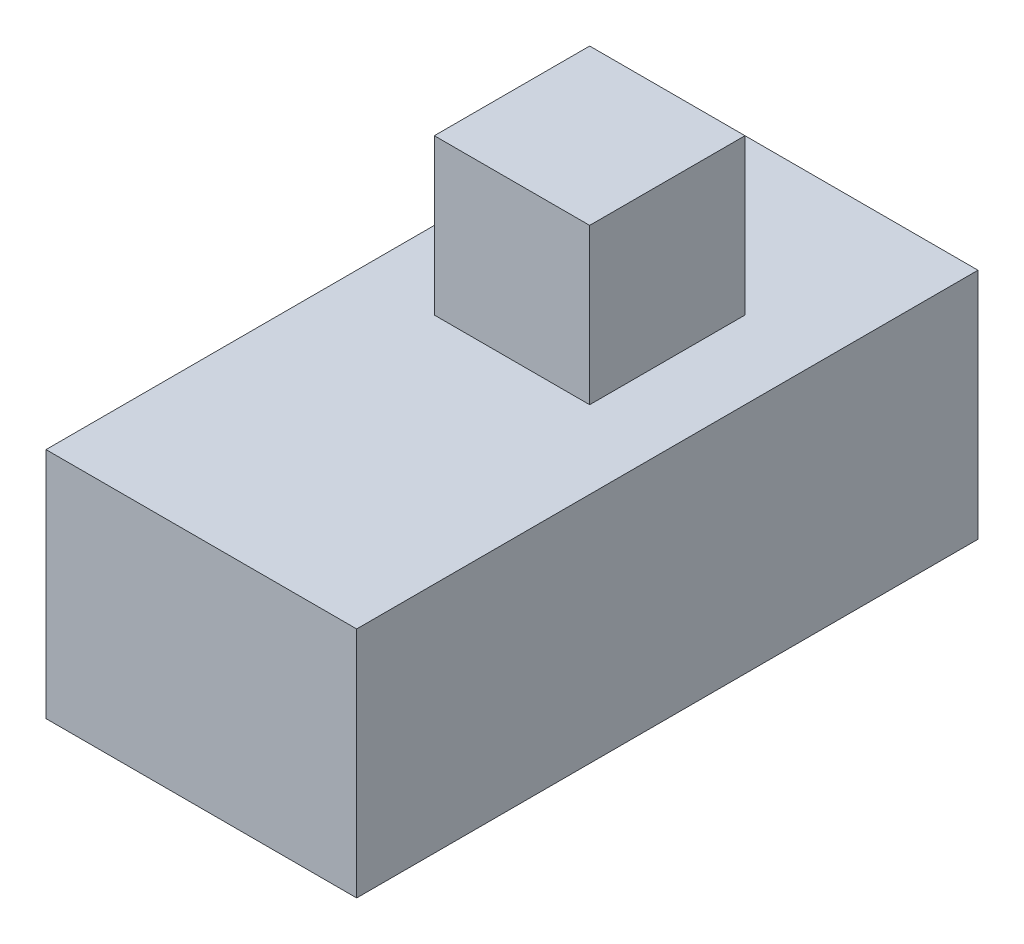
ISO-10303-21;
HEADER;
FILE_DESCRIPTION(('STEP AP214'),'2;1');
FILE_NAME('part.step','',(''),(''),'','','');
FILE_SCHEMA(('AUTOMOTIVE_DESIGN { 1 0 10303 214 1 1 1 1 }'));
ENDSEC;
DATA;
#1=APPLICATION_CONTEXT('core data for automotive mechanical design processes');
#2=APPLICATION_PROTOCOL_DEFINITION('international standard','automotive_design',2000,#1);
#3=PRODUCT_CONTEXT('',#1,'mechanical');
#4=PRODUCT('Part','Part','',(#3));
#5=PRODUCT_RELATED_PRODUCT_CATEGORY('part','',(#4));
#6=PRODUCT_DEFINITION_FORMATION('','',#4);
#7=PRODUCT_DEFINITION_CONTEXT('part definition',#1,'design');
#8=PRODUCT_DEFINITION('design','',#6,#7);
#9=PRODUCT_DEFINITION_SHAPE('','',#8);
#10=(LENGTH_UNIT() NAMED_UNIT(*) SI_UNIT(.MILLI.,.METRE.));
#11=(NAMED_UNIT(*) PLANE_ANGLE_UNIT() SI_UNIT($,.RADIAN.));
#12=(NAMED_UNIT(*) SI_UNIT($,.STERADIAN.) SOLID_ANGLE_UNIT());
#13=UNCERTAINTY_MEASURE_WITH_UNIT(LENGTH_MEASURE(1.E-05),#10,'distance_accuracy_value','');
#14=(GEOMETRIC_REPRESENTATION_CONTEXT(3) GLOBAL_UNCERTAINTY_ASSIGNED_CONTEXT((#13)) GLOBAL_UNIT_ASSIGNED_CONTEXT((#10,
#11,#12)) REPRESENTATION_CONTEXT('',''));
#15=CARTESIAN_POINT('',(0.,0.,0.));
#16=DIRECTION('',(0.,0.,1.));
#17=DIRECTION('',(1.,0.,0.));
#18=AXIS2_PLACEMENT_3D('',#15,#16,#17);
#19=CARTESIAN_POINT('',(0.,3.,0.));
#20=DIRECTION('',(0.,1.,0.));
#21=DIRECTION('',(0.,0.,1.));
#22=AXIS2_PLACEMENT_3D('',#19,#20,#21);
#23=PLANE('',#22);
#24=DIRECTION('',(0.,0.,1.));
#25=VECTOR('',#24,1.);
#26=CARTESIAN_POINT('',(0.,3.,0.));
#27=LINE('',#26,#25);
#28=CARTESIAN_POINT('',(0.,3.,0.));
#29=VERTEX_POINT('',#28);
#30=CARTESIAN_POINT('',(0.,3.,8.));
#31=VERTEX_POINT('',#30);
#32=EDGE_CURVE('E140',#29,#31,#27,.T.);
#33=ORIENTED_EDGE('',*,*,#32,.T.);
#34=DIRECTION('',(1.,0.,0.));
#35=VECTOR('',#34,1.);
#36=CARTESIAN_POINT('',(0.,3.,8.));
#37=LINE('',#36,#35);
#38=CARTESIAN_POINT('',(4.,3.,8.));
#39=VERTEX_POINT('',#38);
#40=EDGE_CURVE('E85',#31,#39,#37,.T.);
#41=ORIENTED_EDGE('',*,*,#40,.T.);
#42=DIRECTION('',(0.,0.,-1.));
#43=VECTOR('',#42,1.);
#44=CARTESIAN_POINT('',(4.,3.,0.));
#45=LINE('',#44,#43);
#46=CARTESIAN_POINT('',(4.,3.,0.));
#47=VERTEX_POINT('',#46);
#48=EDGE_CURVE('E143',#39,#47,#45,.T.);
#49=ORIENTED_EDGE('',*,*,#48,.T.);
#50=DIRECTION('',(-1.,0.,0.));
#51=VECTOR('',#50,1.);
#52=CARTESIAN_POINT('',(0.,3.,0.));
#53=LINE('',#52,#51);
#54=EDGE_CURVE('E57',#47,#29,#53,.T.);
#55=ORIENTED_EDGE('',*,*,#54,.T.);
#56=EDGE_LOOP('',(#33,#41,#49,#55));
#57=FACE_BOUND('',#56,.T.);
#58=DIRECTION('',(1.,0.,0.));
#59=VECTOR('',#58,1.);
#60=CARTESIAN_POINT('',(1.,3.,4.));
#61=LINE('',#60,#59);
#62=CARTESIAN_POINT('',(1.,3.,4.));
#63=VERTEX_POINT('',#62);
#64=CARTESIAN_POINT('',(3.,3.,4.));
#65=VERTEX_POINT('',#64);
#66=EDGE_CURVE('E263',#63,#65,#61,.T.);
#67=ORIENTED_EDGE('',*,*,#66,.F.);
#68=DIRECTION('',(0.,0.,1.));
#69=VECTOR('',#68,1.);
#70=CARTESIAN_POINT('',(1.,3.,2.));
#71=LINE('',#70,#69);
#72=CARTESIAN_POINT('',(1.,3.,2.));
#73=VERTEX_POINT('',#72);
#74=EDGE_CURVE('E130',#73,#63,#71,.T.);
#75=ORIENTED_EDGE('',*,*,#74,.F.);
#76=DIRECTION('',(-1.,0.,0.));
#77=VECTOR('',#76,1.);
#78=CARTESIAN_POINT('',(1.,3.,2.));
#79=LINE('',#78,#77);
#80=CARTESIAN_POINT('',(3.,3.,2.));
#81=VERTEX_POINT('',#80);
#82=EDGE_CURVE('E126',#81,#73,#79,.T.);
#83=ORIENTED_EDGE('',*,*,#82,.F.);
#84=DIRECTION('',(0.,0.,-1.));
#85=VECTOR('',#84,1.);
#86=CARTESIAN_POINT('',(3.,3.,2.));
#87=LINE('',#86,#85);
#88=EDGE_CURVE('E260',#65,#81,#87,.T.);
#89=ORIENTED_EDGE('',*,*,#88,.F.);
#90=EDGE_LOOP('',(#67,#75,#83,#89));
#91=FACE_BOUND('',#90,.T.);
#92=ADVANCED_FACE('F33',(#57,#91),#23,.T.);
#93=CARTESIAN_POINT('',(0.,3.,0.));
#94=DIRECTION('',(1.,0.,0.));
#95=DIRECTION('',(0.,0.,-1.));
#96=AXIS2_PLACEMENT_3D('',#93,#94,#95);
#97=PLANE('',#96);
#98=DIRECTION('',(0.,0.,1.));
#99=VECTOR('',#98,1.);
#100=CARTESIAN_POINT('',(0.,0.,0.));
#101=LINE('',#100,#99);
#102=CARTESIAN_POINT('',(0.,0.,0.));
#103=VERTEX_POINT('',#102);
#104=CARTESIAN_POINT('',(0.,0.,8.));
#105=VERTEX_POINT('',#104);
#106=EDGE_CURVE('E132',#103,#105,#101,.T.);
#107=ORIENTED_EDGE('',*,*,#106,.T.);
#108=DIRECTION('',(0.,-1.,0.));
#109=VECTOR('',#108,1.);
#110=CARTESIAN_POINT('',(0.,3.,8.));
#111=LINE('',#110,#109);
#112=EDGE_CURVE('E11',#31,#105,#111,.T.);
#113=ORIENTED_EDGE('',*,*,#112,.F.);
#114=ORIENTED_EDGE('',*,*,#32,.F.);
#115=DIRECTION('',(0.,-1.,0.));
#116=VECTOR('',#115,1.);
#117=CARTESIAN_POINT('',(0.,3.,0.));
#118=LINE('',#117,#116);
#119=EDGE_CURVE('E145',#29,#103,#118,.T.);
#120=ORIENTED_EDGE('',*,*,#119,.T.);
#121=EDGE_LOOP('',(#107,#113,#114,#120));
#122=FACE_BOUND('',#121,.T.);
#123=ADVANCED_FACE('F35',(#122),#97,.F.);
#124=CARTESIAN_POINT('',(0.,3.,8.));
#125=DIRECTION('',(0.,0.,-1.));
#126=DIRECTION('',(-1.,0.,0.));
#127=AXIS2_PLACEMENT_3D('',#124,#125,#126);
#128=PLANE('',#127);
#129=DIRECTION('',(1.,0.,0.));
#130=VECTOR('',#129,1.);
#131=CARTESIAN_POINT('',(0.,0.,8.));
#132=LINE('',#131,#130);
#133=CARTESIAN_POINT('',(4.,0.,8.));
#134=VERTEX_POINT('',#133);
#135=EDGE_CURVE('E135',#105,#134,#132,.T.);
#136=ORIENTED_EDGE('',*,*,#135,.T.);
#137=DIRECTION('',(0.,-1.,0.));
#138=VECTOR('',#137,1.);
#139=CARTESIAN_POINT('',(4.,3.,8.));
#140=LINE('',#139,#138);
#141=EDGE_CURVE('E41',#39,#134,#140,.T.);
#142=ORIENTED_EDGE('',*,*,#141,.F.);
#143=ORIENTED_EDGE('',*,*,#40,.F.);
#144=ORIENTED_EDGE('',*,*,#112,.T.);
#145=EDGE_LOOP('',(#136,#142,#143,#144));
#146=FACE_BOUND('',#145,.T.);
#147=ADVANCED_FACE('F173',(#146),#128,.F.);
#148=CARTESIAN_POINT('',(4.,3.,0.));
#149=DIRECTION('',(-1.,0.,0.));
#150=DIRECTION('',(0.,0.,1.));
#151=AXIS2_PLACEMENT_3D('',#148,#149,#150);
#152=PLANE('',#151);
#153=DIRECTION('',(0.,0.,-1.));
#154=VECTOR('',#153,1.);
#155=CARTESIAN_POINT('',(4.,0.,0.));
#156=LINE('',#155,#154);
#157=CARTESIAN_POINT('',(4.,0.,0.));
#158=VERTEX_POINT('',#157);
#159=EDGE_CURVE('E148',#134,#158,#156,.T.);
#160=ORIENTED_EDGE('',*,*,#159,.T.);
#161=DIRECTION('',(0.,-1.,0.));
#162=VECTOR('',#161,1.);
#163=CARTESIAN_POINT('',(4.,3.,0.));
#164=LINE('',#163,#162);
#165=EDGE_CURVE('E152',#47,#158,#164,.T.);
#166=ORIENTED_EDGE('',*,*,#165,.F.);
#167=ORIENTED_EDGE('',*,*,#48,.F.);
#168=ORIENTED_EDGE('',*,*,#141,.T.);
#169=EDGE_LOOP('',(#160,#166,#167,#168));
#170=FACE_BOUND('',#169,.T.);
#171=ADVANCED_FACE('F157',(#170),#152,.F.);
#172=CARTESIAN_POINT('',(0.,3.,0.));
#173=DIRECTION('',(0.,0.,1.));
#174=DIRECTION('',(1.,0.,0.));
#175=AXIS2_PLACEMENT_3D('',#172,#173,#174);
#176=PLANE('',#175);
#177=DIRECTION('',(-1.,0.,0.));
#178=VECTOR('',#177,1.);
#179=CARTESIAN_POINT('',(0.,0.,0.));
#180=LINE('',#179,#178);
#181=EDGE_CURVE('E78',#158,#103,#180,.T.);
#182=ORIENTED_EDGE('',*,*,#181,.T.);
#183=ORIENTED_EDGE('',*,*,#119,.F.);
#184=ORIENTED_EDGE('',*,*,#54,.F.);
#185=ORIENTED_EDGE('',*,*,#165,.T.);
#186=EDGE_LOOP('',(#182,#183,#184,#185));
#187=FACE_BOUND('',#186,.T.);
#188=ADVANCED_FACE('F165',(#187),#176,.F.);
#189=CARTESIAN_POINT('',(0.,0.,0.));
#190=DIRECTION('',(0.,1.,0.));
#191=DIRECTION('',(0.,0.,1.));
#192=AXIS2_PLACEMENT_3D('',#189,#190,#191);
#193=PLANE('',#192);
#194=ORIENTED_EDGE('',*,*,#106,.F.);
#195=ORIENTED_EDGE('',*,*,#181,.F.);
#196=ORIENTED_EDGE('',*,*,#159,.F.);
#197=ORIENTED_EDGE('',*,*,#135,.F.);
#198=EDGE_LOOP('',(#194,#195,#196,#197));
#199=FACE_BOUND('',#198,.T.);
#200=ADVANCED_FACE('F161',(#199),#193,.F.);
#201=CARTESIAN_POINT('',(1.,5.,2.));
#202=DIRECTION('',(1.,0.,0.));
#203=DIRECTION('',(0.,0.,-1.));
#204=AXIS2_PLACEMENT_3D('',#201,#202,#203);
#205=PLANE('',#204);
#206=ORIENTED_EDGE('',*,*,#74,.T.);
#207=DIRECTION('',(0.,-1.,0.));
#208=VECTOR('',#207,1.);
#209=CARTESIAN_POINT('',(1.,5.,4.));
#210=LINE('',#209,#208);
#211=CARTESIAN_POINT('',(1.,5.,4.));
#212=VERTEX_POINT('',#211);
#213=EDGE_CURVE('E111',#212,#63,#210,.T.);
#214=ORIENTED_EDGE('',*,*,#213,.F.);
#215=DIRECTION('',(0.,0.,1.));
#216=VECTOR('',#215,1.);
#217=CARTESIAN_POINT('',(1.,5.,2.));
#218=LINE('',#217,#216);
#219=CARTESIAN_POINT('',(1.,5.,2.));
#220=VERTEX_POINT('',#219);
#221=EDGE_CURVE('E118',#220,#212,#218,.T.);
#222=ORIENTED_EDGE('',*,*,#221,.F.);
#223=DIRECTION('',(0.,-1.,0.));
#224=VECTOR('',#223,1.);
#225=CARTESIAN_POINT('',(1.,5.,2.));
#226=LINE('',#225,#224);
#227=EDGE_CURVE('E258',#220,#73,#226,.T.);
#228=ORIENTED_EDGE('',*,*,#227,.T.);
#229=EDGE_LOOP('',(#206,#214,#222,#228));
#230=FACE_BOUND('',#229,.T.);
#231=ADVANCED_FACE('F128',(#230),#205,.F.);
#232=CARTESIAN_POINT('',(1.,5.,4.));
#233=DIRECTION('',(0.,0.,-1.));
#234=DIRECTION('',(-1.,0.,0.));
#235=AXIS2_PLACEMENT_3D('',#232,#233,#234);
#236=PLANE('',#235);
#237=ORIENTED_EDGE('',*,*,#66,.T.);
#238=DIRECTION('',(0.,-1.,0.));
#239=VECTOR('',#238,1.);
#240=CARTESIAN_POINT('',(3.,5.,4.));
#241=LINE('',#240,#239);
#242=CARTESIAN_POINT('',(3.,5.,4.));
#243=VERTEX_POINT('',#242);
#244=EDGE_CURVE('E114',#243,#65,#241,.T.);
#245=ORIENTED_EDGE('',*,*,#244,.F.);
#246=DIRECTION('',(1.,0.,0.));
#247=VECTOR('',#246,1.);
#248=CARTESIAN_POINT('',(1.,5.,4.));
#249=LINE('',#248,#247);
#250=EDGE_CURVE('E107',#212,#243,#249,.T.);
#251=ORIENTED_EDGE('',*,*,#250,.F.);
#252=ORIENTED_EDGE('',*,*,#213,.T.);
#253=EDGE_LOOP('',(#237,#245,#251,#252));
#254=FACE_BOUND('',#253,.T.);
#255=ADVANCED_FACE('F109',(#254),#236,.F.);
#256=CARTESIAN_POINT('',(3.,5.,2.));
#257=DIRECTION('',(-1.,0.,0.));
#258=DIRECTION('',(0.,0.,1.));
#259=AXIS2_PLACEMENT_3D('',#256,#257,#258);
#260=PLANE('',#259);
#261=ORIENTED_EDGE('',*,*,#88,.T.);
#262=DIRECTION('',(0.,-1.,0.));
#263=VECTOR('',#262,1.);
#264=CARTESIAN_POINT('',(3.,5.,2.));
#265=LINE('',#264,#263);
#266=CARTESIAN_POINT('',(3.,5.,2.));
#267=VERTEX_POINT('',#266);
#268=EDGE_CURVE('E48',#267,#81,#265,.T.);
#269=ORIENTED_EDGE('',*,*,#268,.F.);
#270=DIRECTION('',(0.,0.,-1.));
#271=VECTOR('',#270,1.);
#272=CARTESIAN_POINT('',(3.,5.,2.));
#273=LINE('',#272,#271);
#274=EDGE_CURVE('E117',#243,#267,#273,.T.);
#275=ORIENTED_EDGE('',*,*,#274,.F.);
#276=ORIENTED_EDGE('',*,*,#244,.T.);
#277=EDGE_LOOP('',(#261,#269,#275,#276));
#278=FACE_BOUND('',#277,.T.);
#279=ADVANCED_FACE('F186',(#278),#260,.F.);
#280=CARTESIAN_POINT('',(1.,5.,2.));
#281=DIRECTION('',(0.,0.,1.));
#282=DIRECTION('',(1.,0.,0.));
#283=AXIS2_PLACEMENT_3D('',#280,#281,#282);
#284=PLANE('',#283);
#285=ORIENTED_EDGE('',*,*,#82,.T.);
#286=ORIENTED_EDGE('',*,*,#227,.F.);
#287=DIRECTION('',(-1.,0.,0.));
#288=VECTOR('',#287,1.);
#289=CARTESIAN_POINT('',(1.,5.,2.));
#290=LINE('',#289,#288);
#291=EDGE_CURVE('E122',#267,#220,#290,.T.);
#292=ORIENTED_EDGE('',*,*,#291,.F.);
#293=ORIENTED_EDGE('',*,*,#268,.T.);
#294=EDGE_LOOP('',(#285,#286,#292,#293));
#295=FACE_BOUND('',#294,.T.);
#296=ADVANCED_FACE('F189',(#295),#284,.F.);
#297=CARTESIAN_POINT('',(0.,5.,0.));
#298=DIRECTION('',(0.,1.,0.));
#299=DIRECTION('',(0.,0.,1.));
#300=AXIS2_PLACEMENT_3D('',#297,#298,#299);
#301=PLANE('',#300);
#302=ORIENTED_EDGE('',*,*,#221,.T.);
#303=ORIENTED_EDGE('',*,*,#250,.T.);
#304=ORIENTED_EDGE('',*,*,#274,.T.);
#305=ORIENTED_EDGE('',*,*,#291,.T.);
#306=EDGE_LOOP('',(#302,#303,#304,#305));
#307=FACE_BOUND('',#306,.T.);
#308=ADVANCED_FACE('F121',(#307),#301,.T.);
#309=CLOSED_SHELL('',(#92,#123,#147,#171,#188,#200,#231,#255,#279,#296,#308));
#310=MANIFOLD_SOLID_BREP('B2',#309);
#311=ADVANCED_BREP_SHAPE_REPRESENTATION('',(#18,#310),#14);
#312=SHAPE_DEFINITION_REPRESENTATION(#9,#311);
ENDSEC;
END-ISO-10303-21;
